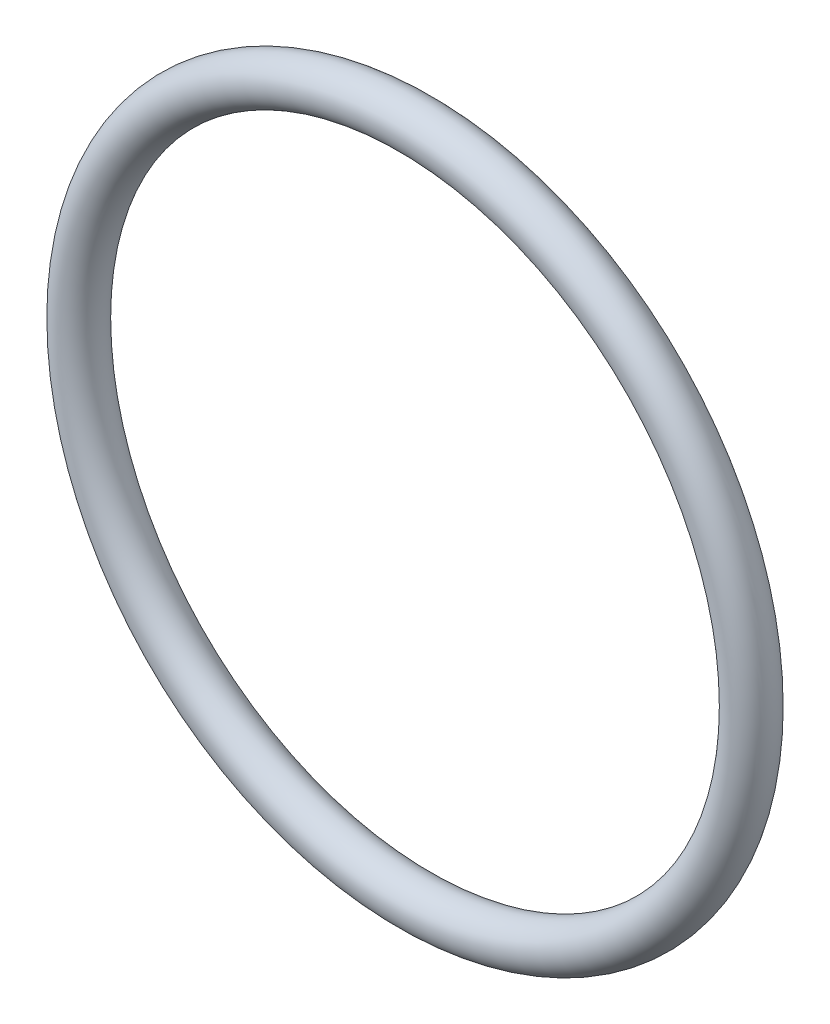
ISO-10303-21;
HEADER;
FILE_DESCRIPTION(('STEP AP214'),'2;1');
FILE_NAME('part.step','',(''),(''),'','','');
FILE_SCHEMA(('AUTOMOTIVE_DESIGN { 1 0 10303 214 1 1 1 1 }'));
ENDSEC;
DATA;
#1=APPLICATION_CONTEXT('core data for automotive mechanical design processes');
#2=APPLICATION_PROTOCOL_DEFINITION('international standard','automotive_design',2000,#1);
#3=PRODUCT_CONTEXT('',#1,'mechanical');
#4=PRODUCT('Part','Part','',(#3));
#5=PRODUCT_RELATED_PRODUCT_CATEGORY('part','',(#4));
#6=PRODUCT_DEFINITION_FORMATION('','',#4);
#7=PRODUCT_DEFINITION_CONTEXT('part definition',#1,'design');
#8=PRODUCT_DEFINITION('design','',#6,#7);
#9=PRODUCT_DEFINITION_SHAPE('','',#8);
#10=(LENGTH_UNIT() NAMED_UNIT(*) SI_UNIT(.MILLI.,.METRE.));
#11=(NAMED_UNIT(*) PLANE_ANGLE_UNIT() SI_UNIT($,.RADIAN.));
#12=(NAMED_UNIT(*) SI_UNIT($,.STERADIAN.) SOLID_ANGLE_UNIT());
#13=UNCERTAINTY_MEASURE_WITH_UNIT(LENGTH_MEASURE(1.E-05),#10,'distance_accuracy_value','');
#14=(GEOMETRIC_REPRESENTATION_CONTEXT(3) GLOBAL_UNCERTAINTY_ASSIGNED_CONTEXT((#13)) GLOBAL_UNIT_ASSIGNED_CONTEXT((#10,
#11,#12)) REPRESENTATION_CONTEXT('',''));
#15=CARTESIAN_POINT('',(0.,0.,0.));
#16=DIRECTION('',(0.,0.,1.));
#17=DIRECTION('',(1.,0.,0.));
#18=AXIS2_PLACEMENT_3D('',#15,#16,#17);
#19=CARTESIAN_POINT('',(0.,0.,0.));
#20=DIRECTION('',(0.,0.,1.));
#21=DIRECTION('',(1.,0.,0.));
#22=AXIS2_PLACEMENT_3D('',#19,#20,#21);
#23=TOROIDAL_SURFACE('',#22,13.4,0.9);
#24=CARTESIAN_POINT('',(14.3,0.,0.));
#25=VERTEX_POINT('',#24);
#26=VERTEX_LOOP('',#25);
#27=FACE_BOUND('',#26,.T.);
#28=ADVANCED_FACE('F33',(#27),#23,.T.);
#29=CLOSED_SHELL('',(#28));
#30=MANIFOLD_SOLID_BREP('B2',#29);
#31=ADVANCED_BREP_SHAPE_REPRESENTATION('',(#18,#30),#14);
#32=SHAPE_DEFINITION_REPRESENTATION(#9,#31);
ENDSEC;
END-ISO-10303-21;
